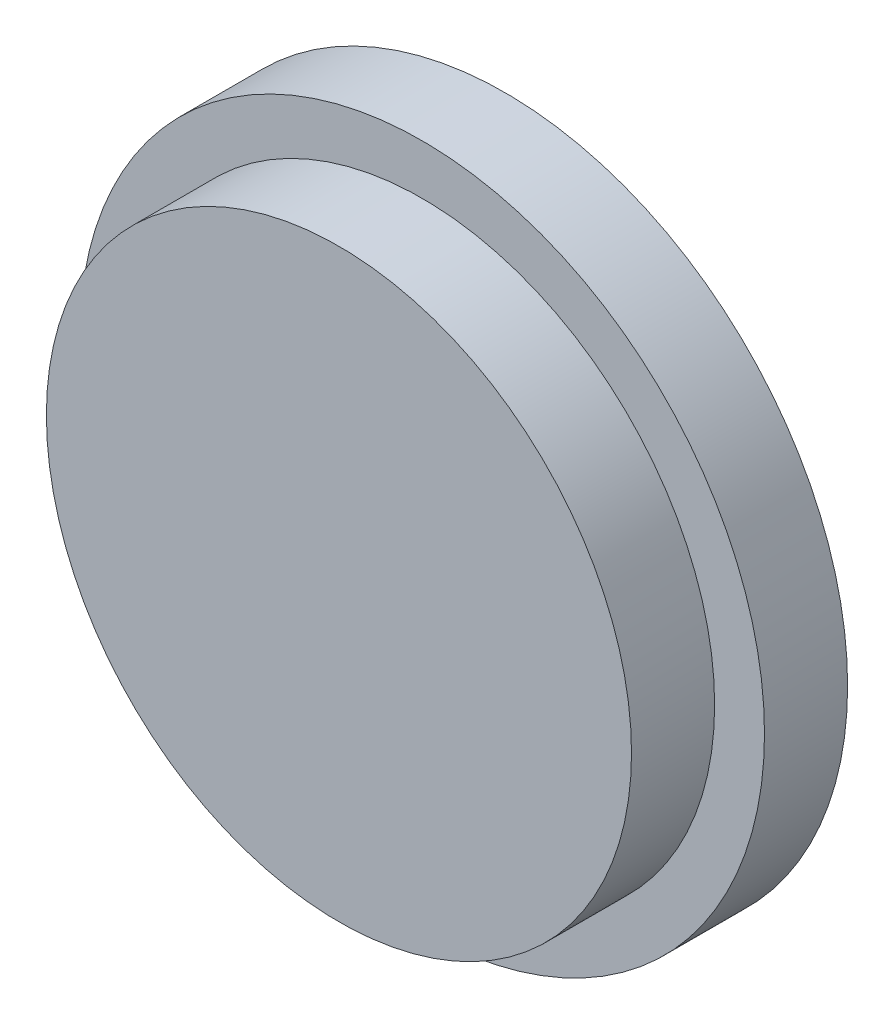
ISO-10303-21;
HEADER;
FILE_DESCRIPTION(('STEP AP214'),'2;1');
FILE_NAME('part.step','',(''),(''),'','','');
FILE_SCHEMA(('AUTOMOTIVE_DESIGN { 1 0 10303 214 1 1 1 1 }'));
ENDSEC;
DATA;
#1=APPLICATION_CONTEXT('core data for automotive mechanical design processes');
#2=APPLICATION_PROTOCOL_DEFINITION('international standard','automotive_design',2000,#1);
#3=PRODUCT_CONTEXT('',#1,'mechanical');
#4=PRODUCT('Part','Part','',(#3));
#5=PRODUCT_RELATED_PRODUCT_CATEGORY('part','',(#4));
#6=PRODUCT_DEFINITION_FORMATION('','',#4);
#7=PRODUCT_DEFINITION_CONTEXT('part definition',#1,'design');
#8=PRODUCT_DEFINITION('design','',#6,#7);
#9=PRODUCT_DEFINITION_SHAPE('','',#8);
#10=(LENGTH_UNIT() NAMED_UNIT(*) SI_UNIT(.MILLI.,.METRE.));
#11=(NAMED_UNIT(*) PLANE_ANGLE_UNIT() SI_UNIT($,.RADIAN.));
#12=(NAMED_UNIT(*) SI_UNIT($,.STERADIAN.) SOLID_ANGLE_UNIT());
#13=UNCERTAINTY_MEASURE_WITH_UNIT(LENGTH_MEASURE(1.E-05),#10,'distance_accuracy_value','');
#14=(GEOMETRIC_REPRESENTATION_CONTEXT(3) GLOBAL_UNCERTAINTY_ASSIGNED_CONTEXT((#13)) GLOBAL_UNIT_ASSIGNED_CONTEXT((#10,
#11,#12)) REPRESENTATION_CONTEXT('',''));
#15=CARTESIAN_POINT('',(0.,0.,0.));
#16=DIRECTION('',(0.,0.,1.));
#17=DIRECTION('',(1.,0.,0.));
#18=AXIS2_PLACEMENT_3D('',#15,#16,#17);
#19=CARTESIAN_POINT('',(0.,0.,20.));
#20=DIRECTION('',(0.,0.,-1.));
#21=DIRECTION('',(-1.,0.,0.));
#22=AXIS2_PLACEMENT_3D('',#19,#20,#21);
#23=CYLINDRICAL_SURFACE('',#22,41.2);
#24=CARTESIAN_POINT('',(0.,0.,0.));
#25=DIRECTION('',(0.,0.,1.));
#26=DIRECTION('',(1.,0.,0.));
#27=AXIS2_PLACEMENT_3D('',#24,#25,#26);
#28=CIRCLE('',#27,41.2);
#29=CARTESIAN_POINT('',(41.2,0.,0.));
#30=VERTEX_POINT('',#29);
#31=EDGE_CURVE('E11',#30,#30,#28,.T.);
#32=ORIENTED_EDGE('',*,*,#31,.T.);
#33=EDGE_LOOP('',(#32));
#34=FACE_BOUND('',#33,.T.);
#35=CARTESIAN_POINT('',(0.,0.,10.));
#36=DIRECTION('',(0.,0.,1.));
#37=DIRECTION('',(1.,0.,0.));
#38=AXIS2_PLACEMENT_3D('',#35,#36,#37);
#39=CIRCLE('',#38,41.2);
#40=CARTESIAN_POINT('',(41.2,0.,10.));
#41=VERTEX_POINT('',#40);
#42=EDGE_CURVE('E34',#41,#41,#39,.T.);
#43=ORIENTED_EDGE('',*,*,#42,.F.);
#44=EDGE_LOOP('',(#43));
#45=FACE_BOUND('',#44,.T.);
#46=ADVANCED_FACE('F31',(#34,#45),#23,.T.);
#47=CARTESIAN_POINT('',(0.,0.,0.));
#48=DIRECTION('',(0.,0.,1.));
#49=DIRECTION('',(1.,0.,0.));
#50=AXIS2_PLACEMENT_3D('',#47,#48,#49);
#51=PLANE('',#50);
#52=ORIENTED_EDGE('',*,*,#31,.F.);
#53=EDGE_LOOP('',(#52));
#54=FACE_BOUND('',#53,.T.);
#55=ADVANCED_FACE('F55',(#54),#51,.F.);
#56=CARTESIAN_POINT('',(0.,0.,10.));
#57=DIRECTION('',(0.,0.,1.));
#58=DIRECTION('',(1.,0.,0.));
#59=AXIS2_PLACEMENT_3D('',#56,#57,#58);
#60=PLANE('',#59);
#61=CARTESIAN_POINT('',(0.,0.,10.));
#62=DIRECTION('',(0.,0.,1.));
#63=DIRECTION('',(1.,0.,0.));
#64=AXIS2_PLACEMENT_3D('',#61,#62,#63);
#65=CIRCLE('',#64,35.2);
#66=CARTESIAN_POINT('',(35.2,0.,10.));
#67=VERTEX_POINT('',#66);
#68=EDGE_CURVE('E41',#67,#67,#65,.T.);
#69=ORIENTED_EDGE('',*,*,#68,.F.);
#70=EDGE_LOOP('',(#69));
#71=FACE_BOUND('',#70,.T.);
#72=ORIENTED_EDGE('',*,*,#42,.T.);
#73=EDGE_LOOP('',(#72));
#74=FACE_BOUND('',#73,.T.);
#75=ADVANCED_FACE('F52',(#71,#74),#60,.T.);
#76=CARTESIAN_POINT('',(0.,0.,10.));
#77=DIRECTION('',(0.,0.,1.));
#78=DIRECTION('',(1.,0.,0.));
#79=AXIS2_PLACEMENT_3D('',#76,#77,#78);
#80=CYLINDRICAL_SURFACE('',#79,35.2);
#81=ORIENTED_EDGE('',*,*,#68,.T.);
#82=EDGE_LOOP('',(#81));
#83=FACE_BOUND('',#82,.T.);
#84=CARTESIAN_POINT('',(0.,0.,20.));
#85=DIRECTION('',(0.,0.,1.));
#86=DIRECTION('',(1.,0.,0.));
#87=AXIS2_PLACEMENT_3D('',#84,#85,#86);
#88=CIRCLE('',#87,35.2);
#89=CARTESIAN_POINT('',(35.2,0.,20.));
#90=VERTEX_POINT('',#89);
#91=EDGE_CURVE('E43',#90,#90,#88,.T.);
#92=ORIENTED_EDGE('',*,*,#91,.F.);
#93=EDGE_LOOP('',(#92));
#94=FACE_BOUND('',#93,.T.);
#95=ADVANCED_FACE('F49',(#83,#94),#80,.T.);
#96=CARTESIAN_POINT('',(0.,0.,20.));
#97=DIRECTION('',(0.,0.,1.));
#98=DIRECTION('',(1.,0.,0.));
#99=AXIS2_PLACEMENT_3D('',#96,#97,#98);
#100=PLANE('',#99);
#101=ORIENTED_EDGE('',*,*,#91,.T.);
#102=EDGE_LOOP('',(#101));
#103=FACE_BOUND('',#102,.T.);
#104=ADVANCED_FACE('F67',(#103),#100,.T.);
#105=CLOSED_SHELL('',(#46,#55,#75,#95,#104));
#106=MANIFOLD_SOLID_BREP('B2',#105);
#107=ADVANCED_BREP_SHAPE_REPRESENTATION('',(#18,#106),#14);
#108=SHAPE_DEFINITION_REPRESENTATION(#9,#107);
ENDSEC;
END-ISO-10303-21;
